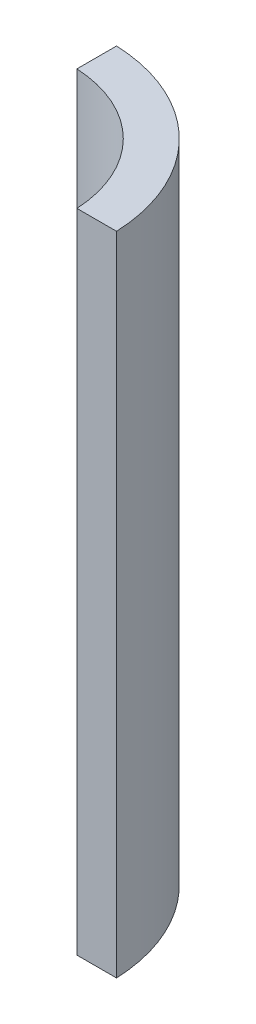
ISO-10303-21;
HEADER;
FILE_DESCRIPTION(('STEP AP214'),'2;1');
FILE_NAME('part.step','',(''),(''),'','','');
FILE_SCHEMA(('AUTOMOTIVE_DESIGN { 1 0 10303 214 1 1 1 1 }'));
ENDSEC;
DATA;
#1=APPLICATION_CONTEXT('core data for automotive mechanical design processes');
#2=APPLICATION_PROTOCOL_DEFINITION('international standard','automotive_design',2000,#1);
#3=PRODUCT_CONTEXT('',#1,'mechanical');
#4=PRODUCT('Part','Part','',(#3));
#5=PRODUCT_RELATED_PRODUCT_CATEGORY('part','',(#4));
#6=PRODUCT_DEFINITION_FORMATION('','',#4);
#7=PRODUCT_DEFINITION_CONTEXT('part definition',#1,'design');
#8=PRODUCT_DEFINITION('design','',#6,#7);
#9=PRODUCT_DEFINITION_SHAPE('','',#8);
#10=(LENGTH_UNIT() NAMED_UNIT(*) SI_UNIT(.MILLI.,.METRE.));
#11=(NAMED_UNIT(*) PLANE_ANGLE_UNIT() SI_UNIT($,.RADIAN.));
#12=(NAMED_UNIT(*) SI_UNIT($,.STERADIAN.) SOLID_ANGLE_UNIT());
#13=UNCERTAINTY_MEASURE_WITH_UNIT(LENGTH_MEASURE(1.E-05),#10,'distance_accuracy_value','');
#14=(GEOMETRIC_REPRESENTATION_CONTEXT(3) GLOBAL_UNCERTAINTY_ASSIGNED_CONTEXT((#13)) GLOBAL_UNIT_ASSIGNED_CONTEXT((#10,
#11,#12)) REPRESENTATION_CONTEXT('',''));
#15=CARTESIAN_POINT('',(0.,0.,0.));
#16=DIRECTION('',(0.,0.,1.));
#17=DIRECTION('',(1.,0.,0.));
#18=AXIS2_PLACEMENT_3D('',#15,#16,#17);
#19=CARTESIAN_POINT('',(0.,147.,0.));
#20=DIRECTION('',(0.,-1.,0.));
#21=DIRECTION('',(0.,0.,-1.));
#22=AXIS2_PLACEMENT_3D('',#19,#20,#21);
#23=CYLINDRICAL_SURFACE('',#22,29.);
#24=CARTESIAN_POINT('',(0.,0.,0.));
#25=DIRECTION('',(0.,1.,0.));
#26=DIRECTION('',(0.,0.,1.));
#27=AXIS2_PLACEMENT_3D('',#24,#25,#26);
#28=CIRCLE('',#27,29.);
#29=CARTESIAN_POINT('',(28.9611809151492,0.,-1.5));
#30=VERTEX_POINT('',#29);
#31=CARTESIAN_POINT('',(1.5,0.,-28.9611809151492));
#32=VERTEX_POINT('',#31);
#33=EDGE_CURVE('E99',#30,#32,#28,.T.);
#34=ORIENTED_EDGE('',*,*,#33,.F.);
#35=DIRECTION('',(0.,-1.,0.));
#36=VECTOR('',#35,1.);
#37=CARTESIAN_POINT('',(28.9611809151492,147.,-1.5));
#38=LINE('',#37,#36);
#39=CARTESIAN_POINT('',(28.9611809151492,147.,-1.5));
#40=VERTEX_POINT('',#39);
#41=EDGE_CURVE('E11',#40,#30,#38,.T.);
#42=ORIENTED_EDGE('',*,*,#41,.F.);
#43=CARTESIAN_POINT('',(0.,147.,0.));
#44=DIRECTION('',(0.,1.,0.));
#45=DIRECTION('',(0.,0.,1.));
#46=AXIS2_PLACEMENT_3D('',#43,#44,#45);
#47=CIRCLE('',#46,29.);
#48=CARTESIAN_POINT('',(1.5,147.,-28.9611809151492));
#49=VERTEX_POINT('',#48);
#50=EDGE_CURVE('E84',#40,#49,#47,.T.);
#51=ORIENTED_EDGE('',*,*,#50,.T.);
#52=DIRECTION('',(0.,-1.,0.));
#53=VECTOR('',#52,1.);
#54=CARTESIAN_POINT('',(1.5,147.,-28.9611809151492));
#55=LINE('',#54,#53);
#56=EDGE_CURVE('E52',#49,#32,#55,.T.);
#57=ORIENTED_EDGE('',*,*,#56,.T.);
#58=EDGE_LOOP('',(#34,#42,#51,#57));
#59=FACE_BOUND('',#58,.T.);
#60=ADVANCED_FACE('F36',(#59),#23,.F.);
#61=CARTESIAN_POINT('',(0.,147.,-1.5));
#62=DIRECTION('',(0.,0.,-1.));
#63=DIRECTION('',(-1.,0.,0.));
#64=AXIS2_PLACEMENT_3D('',#61,#62,#63);
#65=PLANE('',#64);
#66=DIRECTION('',(1.,0.,0.));
#67=VECTOR('',#66,1.);
#68=CARTESIAN_POINT('',(0.,0.,-1.5));
#69=LINE('',#68,#67);
#70=CARTESIAN_POINT('',(37.9703831953274,0.,-1.5));
#71=VERTEX_POINT('',#70);
#72=EDGE_CURVE('E90',#30,#71,#69,.T.);
#73=ORIENTED_EDGE('',*,*,#72,.T.);
#74=DIRECTION('',(0.,-1.,0.));
#75=VECTOR('',#74,1.);
#76=CARTESIAN_POINT('',(37.9703831953274,147.,-1.5));
#77=LINE('',#76,#75);
#78=CARTESIAN_POINT('',(37.9703831953274,147.,-1.5));
#79=VERTEX_POINT('',#78);
#80=EDGE_CURVE('E44',#79,#71,#77,.T.);
#81=ORIENTED_EDGE('',*,*,#80,.F.);
#82=DIRECTION('',(1.,0.,0.));
#83=VECTOR('',#82,1.);
#84=CARTESIAN_POINT('',(0.,147.,-1.5));
#85=LINE('',#84,#83);
#86=EDGE_CURVE('E78',#40,#79,#85,.T.);
#87=ORIENTED_EDGE('',*,*,#86,.F.);
#88=ORIENTED_EDGE('',*,*,#41,.T.);
#89=EDGE_LOOP('',(#73,#81,#87,#88));
#90=FACE_BOUND('',#89,.T.);
#91=ADVANCED_FACE('F88',(#90),#65,.F.);
#92=CARTESIAN_POINT('',(0.,147.,0.));
#93=DIRECTION('',(0.,-1.,0.));
#94=DIRECTION('',(0.,0.,-1.));
#95=AXIS2_PLACEMENT_3D('',#92,#93,#94);
#96=CYLINDRICAL_SURFACE('',#95,38.);
#97=CARTESIAN_POINT('',(0.,0.,0.));
#98=DIRECTION('',(0.,1.,0.));
#99=DIRECTION('',(0.,0.,1.));
#100=AXIS2_PLACEMENT_3D('',#97,#98,#99);
#101=CIRCLE('',#100,38.);
#102=CARTESIAN_POINT('',(1.5,0.,-37.9703831953274));
#103=VERTEX_POINT('',#102);
#104=EDGE_CURVE('E102',#71,#103,#101,.T.);
#105=ORIENTED_EDGE('',*,*,#104,.T.);
#106=DIRECTION('',(0.,-1.,0.));
#107=VECTOR('',#106,1.);
#108=CARTESIAN_POINT('',(1.5,147.,-37.9703831953274));
#109=LINE('',#108,#107);
#110=CARTESIAN_POINT('',(1.5,147.,-37.9703831953274));
#111=VERTEX_POINT('',#110);
#112=EDGE_CURVE('E66',#111,#103,#109,.T.);
#113=ORIENTED_EDGE('',*,*,#112,.F.);
#114=CARTESIAN_POINT('',(0.,147.,0.));
#115=DIRECTION('',(0.,1.,0.));
#116=DIRECTION('',(0.,0.,1.));
#117=AXIS2_PLACEMENT_3D('',#114,#115,#116);
#118=CIRCLE('',#117,38.);
#119=EDGE_CURVE('E83',#79,#111,#118,.T.);
#120=ORIENTED_EDGE('',*,*,#119,.F.);
#121=ORIENTED_EDGE('',*,*,#80,.T.);
#122=EDGE_LOOP('',(#105,#113,#120,#121));
#123=FACE_BOUND('',#122,.T.);
#124=ADVANCED_FACE('F93',(#123),#96,.T.);
#125=CARTESIAN_POINT('',(1.5,147.,0.));
#126=DIRECTION('',(-1.,0.,0.));
#127=DIRECTION('',(0.,0.,1.));
#128=AXIS2_PLACEMENT_3D('',#125,#126,#127);
#129=PLANE('',#128);
#130=DIRECTION('',(0.,0.,-1.));
#131=VECTOR('',#130,1.);
#132=CARTESIAN_POINT('',(1.5,0.,0.));
#133=LINE('',#132,#131);
#134=EDGE_CURVE('E104',#32,#103,#133,.T.);
#135=ORIENTED_EDGE('',*,*,#134,.F.);
#136=ORIENTED_EDGE('',*,*,#56,.F.);
#137=DIRECTION('',(0.,0.,-1.));
#138=VECTOR('',#137,1.);
#139=CARTESIAN_POINT('',(1.5,147.,0.));
#140=LINE('',#139,#138);
#141=EDGE_CURVE('E94',#49,#111,#140,.T.);
#142=ORIENTED_EDGE('',*,*,#141,.T.);
#143=ORIENTED_EDGE('',*,*,#112,.T.);
#144=EDGE_LOOP('',(#135,#136,#142,#143));
#145=FACE_BOUND('',#144,.T.);
#146=ADVANCED_FACE('F109',(#145),#129,.T.);
#147=CARTESIAN_POINT('',(0.,147.,0.));
#148=DIRECTION('',(0.,1.,0.));
#149=DIRECTION('',(0.,0.,1.));
#150=AXIS2_PLACEMENT_3D('',#147,#148,#149);
#151=PLANE('',#150);
#152=ORIENTED_EDGE('',*,*,#50,.F.);
#153=ORIENTED_EDGE('',*,*,#86,.T.);
#154=ORIENTED_EDGE('',*,*,#119,.T.);
#155=ORIENTED_EDGE('',*,*,#141,.F.);
#156=EDGE_LOOP('',(#152,#153,#154,#155));
#157=FACE_BOUND('',#156,.T.);
#158=ADVANCED_FACE('F80',(#157),#151,.T.);
#159=CARTESIAN_POINT('',(0.,0.,0.));
#160=DIRECTION('',(0.,1.,0.));
#161=DIRECTION('',(0.,0.,1.));
#162=AXIS2_PLACEMENT_3D('',#159,#160,#161);
#163=PLANE('',#162);
#164=ORIENTED_EDGE('',*,*,#33,.T.);
#165=ORIENTED_EDGE('',*,*,#134,.T.);
#166=ORIENTED_EDGE('',*,*,#104,.F.);
#167=ORIENTED_EDGE('',*,*,#72,.F.);
#168=EDGE_LOOP('',(#164,#165,#166,#167));
#169=FACE_BOUND('',#168,.T.);
#170=ADVANCED_FACE('F116',(#169),#163,.F.);
#171=CLOSED_SHELL('',(#60,#91,#124,#146,#158,#170));
#172=MANIFOLD_SOLID_BREP('B2',#171);
#173=ADVANCED_BREP_SHAPE_REPRESENTATION('',(#18,#172),#14);
#174=SHAPE_DEFINITION_REPRESENTATION(#9,#173);
ENDSEC;
END-ISO-10303-21;
